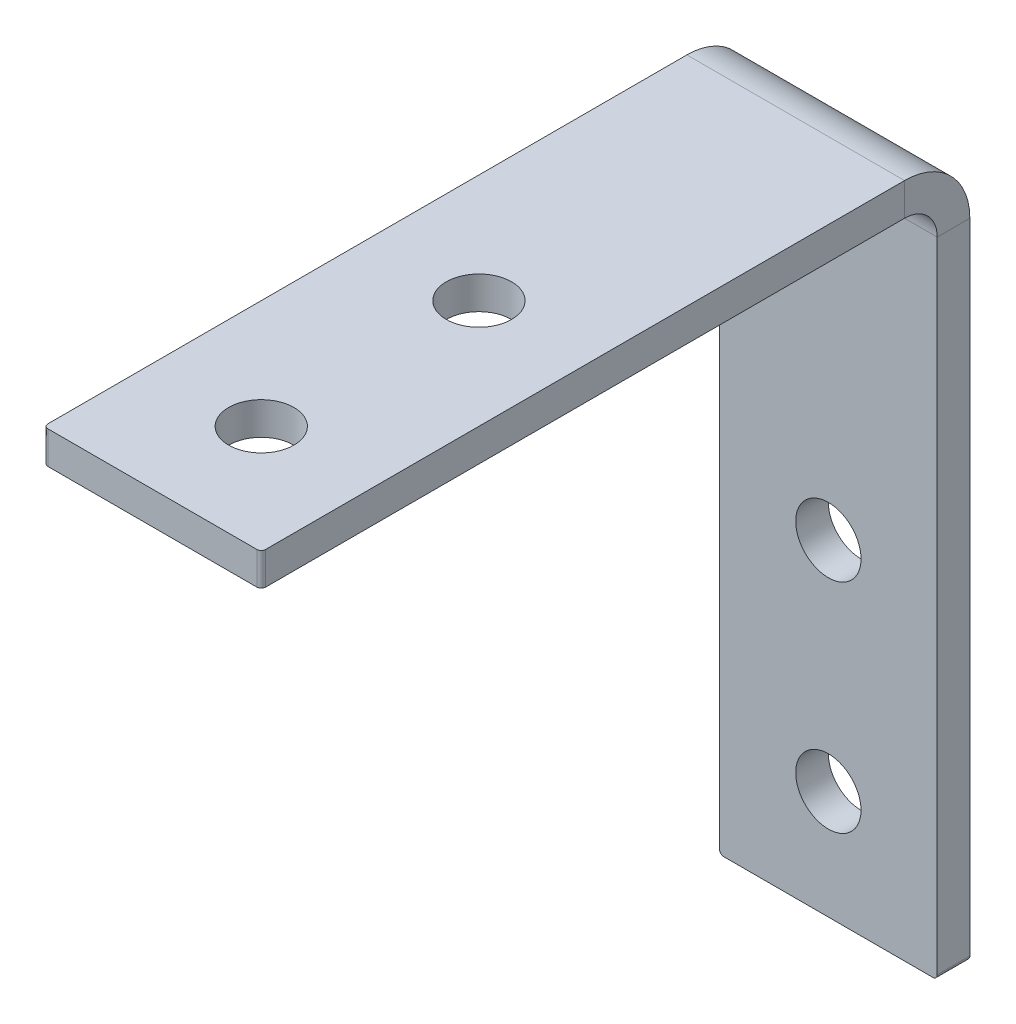
ISO-10303-21;
HEADER;
FILE_DESCRIPTION(('STEP AP214'),'2;1');
FILE_NAME('part.step','',(''),(''),'','','');
FILE_SCHEMA(('AUTOMOTIVE_DESIGN { 1 0 10303 214 1 1 1 1 }'));
ENDSEC;
DATA;
#1=APPLICATION_CONTEXT('core data for automotive mechanical design processes');
#2=APPLICATION_PROTOCOL_DEFINITION('international standard','automotive_design',2000,#1);
#3=PRODUCT_CONTEXT('',#1,'mechanical');
#4=PRODUCT('Part','Part','',(#3));
#5=PRODUCT_RELATED_PRODUCT_CATEGORY('part','',(#4));
#6=PRODUCT_DEFINITION_FORMATION('','',#4);
#7=PRODUCT_DEFINITION_CONTEXT('part definition',#1,'design');
#8=PRODUCT_DEFINITION('design','',#6,#7);
#9=PRODUCT_DEFINITION_SHAPE('','',#8);
#10=(LENGTH_UNIT() NAMED_UNIT(*) SI_UNIT(.MILLI.,.METRE.));
#11=(NAMED_UNIT(*) PLANE_ANGLE_UNIT() SI_UNIT($,.RADIAN.));
#12=(NAMED_UNIT(*) SI_UNIT($,.STERADIAN.) SOLID_ANGLE_UNIT());
#13=UNCERTAINTY_MEASURE_WITH_UNIT(LENGTH_MEASURE(1.E-05),#10,'distance_accuracy_value','');
#14=(GEOMETRIC_REPRESENTATION_CONTEXT(3) GLOBAL_UNCERTAINTY_ASSIGNED_CONTEXT((#13)) GLOBAL_UNIT_ASSIGNED_CONTEXT((#10,
#11,#12)) REPRESENTATION_CONTEXT('',''));
#15=CARTESIAN_POINT('',(0.,0.,0.));
#16=DIRECTION('',(0.,0.,1.));
#17=DIRECTION('',(1.,0.,0.));
#18=AXIS2_PLACEMENT_3D('',#15,#16,#17);
#19=CARTESIAN_POINT('',(10.,-1.69646003293849,-3.375));
#20=DIRECTION('',(1.,0.,0.));
#21=DIRECTION('',(0.,1.,0.));
#22=AXIS2_PLACEMENT_3D('',#19,#20,#21);
#23=PLANE('',#22);
#24=CARTESIAN_POINT('',(10.,-1.69646003293849,2.25));
#25=DIRECTION('',(-1.,0.,0.));
#26=DIRECTION('',(0.,0.,-1.));
#27=AXIS2_PLACEMENT_3D('',#24,#25,#26);
#28=CIRCLE('',#27,3.);
#29=CARTESIAN_POINT('',(10.,1.30353996706151,2.25));
#30=VERTEX_POINT('',#29);
#31=CARTESIAN_POINT('',(10.,-1.69646003293849,-0.75));
#32=VERTEX_POINT('',#31);
#33=EDGE_CURVE('E26',#30,#32,#28,.T.);
#34=ORIENTED_EDGE('',*,*,#33,.F.);
#35=DIRECTION('',(0.,1.,0.));
#36=VECTOR('',#35,1.);
#37=CARTESIAN_POINT('',(10.,-0.196460032938488,2.25));
#38=LINE('',#37,#36);
#39=CARTESIAN_POINT('',(10.,-0.196460032938488,2.25));
#40=VERTEX_POINT('',#39);
#41=EDGE_CURVE('E40',#40,#30,#38,.T.);
#42=ORIENTED_EDGE('',*,*,#41,.F.);
#43=CARTESIAN_POINT('',(10.,-1.69646003293849,2.25));
#44=DIRECTION('',(1.,0.,0.));
#45=DIRECTION('',(0.,0.,-1.));
#46=AXIS2_PLACEMENT_3D('',#43,#44,#45);
#47=CIRCLE('',#46,1.5);
#48=CARTESIAN_POINT('',(10.,-1.69646003293849,0.75));
#49=VERTEX_POINT('',#48);
#50=EDGE_CURVE('E246',#49,#40,#47,.T.);
#51=ORIENTED_EDGE('',*,*,#50,.F.);
#52=DIRECTION('',(0.,0.,1.));
#53=VECTOR('',#52,1.);
#54=CARTESIAN_POINT('',(10.,-1.69646003293849,-0.75));
#55=LINE('',#54,#53);
#56=EDGE_CURVE('E313',#32,#49,#55,.T.);
#57=ORIENTED_EDGE('',*,*,#56,.F.);
#58=EDGE_LOOP('',(#34,#42,#51,#57));
#59=FACE_BOUND('',#58,.T.);
#60=ADVANCED_FACE('F15',(#59),#23,.T.);
#61=CARTESIAN_POINT('',(0.,-1.69646003293849,-3.375));
#62=DIRECTION('',(1.,0.,0.));
#63=DIRECTION('',(0.,1.,0.));
#64=AXIS2_PLACEMENT_3D('',#61,#62,#63);
#65=PLANE('',#64);
#66=CARTESIAN_POINT('',(0.,-1.69646003293849,2.25));
#67=DIRECTION('',(1.,0.,0.));
#68=DIRECTION('',(0.,0.,-1.));
#69=AXIS2_PLACEMENT_3D('',#66,#67,#68);
#70=CIRCLE('',#69,3.);
#71=CARTESIAN_POINT('',(0.,-1.69646003293849,-0.75));
#72=VERTEX_POINT('',#71);
#73=CARTESIAN_POINT('',(0.,1.30353996706151,2.25));
#74=VERTEX_POINT('',#73);
#75=EDGE_CURVE('E10',#72,#74,#70,.T.);
#76=ORIENTED_EDGE('',*,*,#75,.F.);
#77=DIRECTION('',(0.,0.,-1.));
#78=VECTOR('',#77,1.);
#79=CARTESIAN_POINT('',(0.,-1.69646003293849,0.75));
#80=LINE('',#79,#78);
#81=CARTESIAN_POINT('',(0.,-1.69646003293849,0.75));
#82=VERTEX_POINT('',#81);
#83=EDGE_CURVE('E247',#82,#72,#80,.T.);
#84=ORIENTED_EDGE('',*,*,#83,.F.);
#85=CARTESIAN_POINT('',(0.,-1.69646003293849,2.25));
#86=DIRECTION('',(-1.,0.,0.));
#87=DIRECTION('',(0.,0.,-1.));
#88=AXIS2_PLACEMENT_3D('',#85,#86,#87);
#89=CIRCLE('',#88,1.5);
#90=CARTESIAN_POINT('',(0.,-0.196460032938488,2.25));
#91=VERTEX_POINT('',#90);
#92=EDGE_CURVE('E242',#91,#82,#89,.T.);
#93=ORIENTED_EDGE('',*,*,#92,.F.);
#94=DIRECTION('',(0.,-1.,0.));
#95=VECTOR('',#94,1.);
#96=CARTESIAN_POINT('',(0.,1.30353996706151,2.25));
#97=LINE('',#96,#95);
#98=EDGE_CURVE('E208',#74,#91,#97,.T.);
#99=ORIENTED_EDGE('',*,*,#98,.F.);
#100=EDGE_LOOP('',(#76,#84,#93,#99));
#101=FACE_BOUND('',#100,.T.);
#102=ADVANCED_FACE('F370',(#101),#65,.F.);
#103=CARTESIAN_POINT('',(5.,-1.69646003293849,2.25));
#104=DIRECTION('',(1.,0.,0.));
#105=DIRECTION('',(0.,0.,-1.));
#106=AXIS2_PLACEMENT_3D('',#103,#104,#105);
#107=CYLINDRICAL_SURFACE('',#106,3.);
#108=ORIENTED_EDGE('',*,*,#75,.T.);
#109=DIRECTION('',(-1.,0.,0.));
#110=VECTOR('',#109,1.);
#111=CARTESIAN_POINT('',(10.,1.30353996706151,2.25));
#112=LINE('',#111,#110);
#113=EDGE_CURVE('E260',#30,#74,#112,.T.);
#114=ORIENTED_EDGE('',*,*,#113,.F.);
#115=ORIENTED_EDGE('',*,*,#33,.T.);
#116=DIRECTION('',(1.,0.,0.));
#117=VECTOR('',#116,1.);
#118=CARTESIAN_POINT('',(0.,-1.69646003293849,-0.75));
#119=LINE('',#118,#117);
#120=EDGE_CURVE('E279',#72,#32,#119,.T.);
#121=ORIENTED_EDGE('',*,*,#120,.F.);
#122=EDGE_LOOP('',(#108,#114,#115,#121));
#123=FACE_BOUND('',#122,.T.);
#124=ADVANCED_FACE('F372',(#123),#107,.T.);
#125=CARTESIAN_POINT('',(5.,-1.69646003293849,2.25));
#126=DIRECTION('',(1.,0.,0.));
#127=DIRECTION('',(0.,0.,-1.));
#128=AXIS2_PLACEMENT_3D('',#125,#126,#127);
#129=CYLINDRICAL_SURFACE('',#128,1.5);
#130=ORIENTED_EDGE('',*,*,#92,.T.);
#131=DIRECTION('',(-1.,0.,0.));
#132=VECTOR('',#131,1.);
#133=CARTESIAN_POINT('',(10.,-1.69646003293849,0.75));
#134=LINE('',#133,#132);
#135=EDGE_CURVE('E308',#49,#82,#134,.T.);
#136=ORIENTED_EDGE('',*,*,#135,.F.);
#137=ORIENTED_EDGE('',*,*,#50,.T.);
#138=DIRECTION('',(1.,0.,0.));
#139=VECTOR('',#138,1.);
#140=CARTESIAN_POINT('',(0.,-0.196460032938488,2.25));
#141=LINE('',#140,#139);
#142=EDGE_CURVE('E237',#91,#40,#141,.T.);
#143=ORIENTED_EDGE('',*,*,#142,.F.);
#144=EDGE_LOOP('',(#130,#136,#137,#143));
#145=FACE_BOUND('',#144,.T.);
#146=ADVANCED_FACE('F536',(#145),#129,.F.);
#147=CARTESIAN_POINT('',(5.,15.3554568738932,0.75));
#148=DIRECTION('',(0.,0.,1.));
#149=DIRECTION('',(1.,0.,0.));
#150=AXIS2_PLACEMENT_3D('',#147,#148,#149);
#151=PLANE('',#150);
#152=ORIENTED_EDGE('',*,*,#135,.T.);
#153=DIRECTION('',(0.,1.,0.));
#154=VECTOR('',#153,1.);
#155=CARTESIAN_POINT('',(0.,-31.05,0.75));
#156=LINE('',#155,#154);
#157=CARTESIAN_POINT('',(0.,-31.05,0.75));
#158=VERTEX_POINT('',#157);
#159=EDGE_CURVE('E252',#158,#82,#156,.T.);
#160=ORIENTED_EDGE('',*,*,#159,.F.);
#161=CARTESIAN_POINT('',(0.20000000000001,-31.05,0.75));
#162=DIRECTION('',(0.,0.,-1.));
#163=DIRECTION('',(-0.707106781186539,-0.707106781186556,0.));
#164=AXIS2_PLACEMENT_3D('',#161,#162,#163);
#165=CIRCLE('',#164,0.2);
#166=CARTESIAN_POINT('',(0.200000000000009,-31.25,0.75));
#167=VERTEX_POINT('',#166);
#168=EDGE_CURVE('E203',#167,#158,#165,.T.);
#169=ORIENTED_EDGE('',*,*,#168,.F.);
#170=DIRECTION('',(1.,0.,0.));
#171=VECTOR('',#170,1.);
#172=CARTESIAN_POINT('',(0.200000000000008,-31.25,0.75));
#173=LINE('',#172,#171);
#174=CARTESIAN_POINT('',(9.8,-31.25,0.75));
#175=VERTEX_POINT('',#174);
#176=EDGE_CURVE('E19',#167,#175,#173,.T.);
#177=ORIENTED_EDGE('',*,*,#176,.T.);
#178=CARTESIAN_POINT('',(9.8,-31.05,0.75));
#179=DIRECTION('',(0.,0.,-1.));
#180=DIRECTION('',(0.707106781186551,-0.707106781186544,0.));
#181=AXIS2_PLACEMENT_3D('',#178,#179,#180);
#182=CIRCLE('',#181,0.2);
#183=CARTESIAN_POINT('',(10.,-31.05,0.75));
#184=VERTEX_POINT('',#183);
#185=EDGE_CURVE('E301',#184,#175,#182,.T.);
#186=ORIENTED_EDGE('',*,*,#185,.F.);
#187=DIRECTION('',(0.,1.,0.));
#188=VECTOR('',#187,1.);
#189=CARTESIAN_POINT('',(10.,-31.05,0.75));
#190=LINE('',#189,#188);
#191=EDGE_CURVE('E251',#184,#49,#190,.T.);
#192=ORIENTED_EDGE('',*,*,#191,.T.);
#193=EDGE_LOOP('',(#152,#160,#169,#177,#186,#192));
#194=FACE_BOUND('',#193,.T.);
#195=CARTESIAN_POINT('',(5.,-26.25,0.75));
#196=DIRECTION('',(0.,0.,1.));
#197=DIRECTION('',(-1.,0.,0.));
#198=AXIS2_PLACEMENT_3D('',#195,#196,#197);
#199=CIRCLE('',#198,1.5);
#200=CARTESIAN_POINT('',(6.5,-26.25,0.75));
#201=VERTEX_POINT('',#200);
#202=EDGE_CURVE('E219',#201,#201,#199,.T.);
#203=ORIENTED_EDGE('',*,*,#202,.F.);
#204=EDGE_LOOP('',(#203));
#205=FACE_BOUND('',#204,.T.);
#206=CARTESIAN_POINT('',(5.,-16.25,0.75));
#207=DIRECTION('',(0.,0.,1.));
#208=DIRECTION('',(-1.,0.,0.));
#209=AXIS2_PLACEMENT_3D('',#206,#207,#208);
#210=CIRCLE('',#209,1.5);
#211=CARTESIAN_POINT('',(6.5,-16.25,0.75));
#212=VERTEX_POINT('',#211);
#213=EDGE_CURVE('E276',#212,#212,#210,.T.);
#214=ORIENTED_EDGE('',*,*,#213,.F.);
#215=EDGE_LOOP('',(#214));
#216=FACE_BOUND('',#215,.T.);
#217=ADVANCED_FACE('F587',(#194,#205,#216),#151,.T.);
#218=CARTESIAN_POINT('',(0.,0.,0.));
#219=DIRECTION('',(-1.,0.,0.));
#220=DIRECTION('',(0.,0.,1.));
#221=AXIS2_PLACEMENT_3D('',#218,#219,#220);
#222=PLANE('',#221);
#223=ORIENTED_EDGE('',*,*,#83,.T.);
#224=DIRECTION('',(0.,1.,0.));
#225=VECTOR('',#224,1.);
#226=CARTESIAN_POINT('',(0.,-31.05,-0.75));
#227=LINE('',#226,#225);
#228=CARTESIAN_POINT('',(0.,-31.05,-0.75));
#229=VERTEX_POINT('',#228);
#230=EDGE_CURVE('E297',#229,#72,#227,.T.);
#231=ORIENTED_EDGE('',*,*,#230,.F.);
#232=DIRECTION('',(0.,0.,-1.));
#233=VECTOR('',#232,1.);
#234=CARTESIAN_POINT('',(0.,-31.05,0.75));
#235=LINE('',#234,#233);
#236=EDGE_CURVE('E207',#158,#229,#235,.T.);
#237=ORIENTED_EDGE('',*,*,#236,.F.);
#238=ORIENTED_EDGE('',*,*,#159,.T.);
#239=EDGE_LOOP('',(#223,#231,#237,#238));
#240=FACE_BOUND('',#239,.T.);
#241=ADVANCED_FACE('F582',(#240),#222,.T.);
#242=CARTESIAN_POINT('',(9.8,-31.05,0.));
#243=DIRECTION('',(0.,0.,1.));
#244=DIRECTION('',(0.707106781186551,-0.707106781186544,0.));
#245=AXIS2_PLACEMENT_3D('',#242,#243,#244);
#246=CYLINDRICAL_SURFACE('',#245,0.2);
#247=ORIENTED_EDGE('',*,*,#185,.T.);
#248=DIRECTION('',(0.,0.,-1.));
#249=VECTOR('',#248,1.);
#250=CARTESIAN_POINT('',(9.8,-31.25,0.75));
#251=LINE('',#250,#249);
#252=CARTESIAN_POINT('',(9.8,-31.25,-0.75));
#253=VERTEX_POINT('',#252);
#254=EDGE_CURVE('E340',#175,#253,#251,.T.);
#255=ORIENTED_EDGE('',*,*,#254,.T.);
#256=CARTESIAN_POINT('',(9.8,-31.05,-0.75));
#257=DIRECTION('',(0.,0.,1.));
#258=DIRECTION('',(0.707106781186551,-0.707106781186544,0.));
#259=AXIS2_PLACEMENT_3D('',#256,#257,#258);
#260=CIRCLE('',#259,0.2);
#261=CARTESIAN_POINT('',(10.,-31.05,-0.75));
#262=VERTEX_POINT('',#261);
#263=EDGE_CURVE('E334',#253,#262,#260,.T.);
#264=ORIENTED_EDGE('',*,*,#263,.T.);
#265=DIRECTION('',(0.,0.,1.));
#266=VECTOR('',#265,1.);
#267=CARTESIAN_POINT('',(10.,-31.05,-0.75));
#268=LINE('',#267,#266);
#269=EDGE_CURVE('E206',#262,#184,#268,.T.);
#270=ORIENTED_EDGE('',*,*,#269,.T.);
#271=EDGE_LOOP('',(#247,#255,#264,#270));
#272=FACE_BOUND('',#271,.T.);
#273=ADVANCED_FACE('F586',(#272),#246,.T.);
#274=CARTESIAN_POINT('',(9.8,-31.25,-0.75));
#275=CARTESIAN_POINT('',(0.200000000000008,-31.25,-0.75));
#276=CARTESIAN_POINT('',(9.8,-31.25,0.75));
#277=CARTESIAN_POINT('',(0.200000000000008,-31.25,0.75));
#278=(BOUNDED_SURFACE() B_SPLINE_SURFACE(1,1,((#274,#275),(#276,#277)),.UNSPECIFIED.,.F.,.F.,
.F.) B_SPLINE_SURFACE_WITH_KNOTS((2,2),(2,2),(0.,1.5),(0.,9.6),
.UNSPECIFIED.) GEOMETRIC_REPRESENTATION_ITEM() RATIONAL_B_SPLINE_SURFACE(((1.,1.),(1.,1.))) REPRESENTATION_ITEM('') SURFACE());
#279=DIRECTION('',(0.,0.,1.));
#280=VECTOR('',#279,1.);
#281=CARTESIAN_POINT('',(0.20000000000001,-31.25,-0.75));
#282=LINE('',#281,#280);
#283=CARTESIAN_POINT('',(0.200000000000009,-31.25,-0.75));
#284=VERTEX_POINT('',#283);
#285=EDGE_CURVE('E228',#284,#167,#282,.T.);
#286=DIRECTION('',(-1.,0.,0.));
#287=VECTOR('',#286,1.);
#288=CARTESIAN_POINT('',(9.8,-31.25,-0.75));
#289=LINE('',#288,#287);
#290=EDGE_CURVE('E288',#253,#284,#289,.T.);
#291=ORIENTED_EDGE('',*,*,#254,.F.);
#292=ORIENTED_EDGE('',*,*,#176,.F.);
#293=ORIENTED_EDGE('',*,*,#285,.F.);
#294=ORIENTED_EDGE('',*,*,#290,.F.);
#295=EDGE_LOOP('',(#291,#292,#293,#294));
#296=FACE_BOUND('',#295,.T.);
#297=ADVANCED_FACE('F602',(#296),#278,.T.);
#298=CARTESIAN_POINT('',(0.20000000000001,-31.05,0.));
#299=DIRECTION('',(0.,0.,1.));
#300=DIRECTION('',(-0.707106781186539,-0.707106781186556,0.));
#301=AXIS2_PLACEMENT_3D('',#298,#299,#300);
#302=CYLINDRICAL_SURFACE('',#301,0.2);
#303=ORIENTED_EDGE('',*,*,#168,.T.);
#304=ORIENTED_EDGE('',*,*,#236,.T.);
#305=CARTESIAN_POINT('',(0.20000000000001,-31.05,-0.75));
#306=DIRECTION('',(0.,0.,1.));
#307=DIRECTION('',(-0.707106781186539,-0.707106781186556,0.));
#308=AXIS2_PLACEMENT_3D('',#305,#306,#307);
#309=CIRCLE('',#308,0.2);
#310=EDGE_CURVE('E269',#229,#284,#309,.T.);
#311=ORIENTED_EDGE('',*,*,#310,.T.);
#312=ORIENTED_EDGE('',*,*,#285,.T.);
#313=EDGE_LOOP('',(#303,#304,#311,#312));
#314=FACE_BOUND('',#313,.T.);
#315=ADVANCED_FACE('F576',(#314),#302,.T.);
#316=CARTESIAN_POINT('',(6.5,-26.25,-0.75));
#317=CARTESIAN_POINT('',(6.5,-27.75,-0.75));
#318=CARTESIAN_POINT('',(5.,-27.75,-0.75));
#319=CARTESIAN_POINT('',(3.49999999999999,-27.75,-0.75));
#320=CARTESIAN_POINT('',(3.5,-26.25,-0.75));
#321=CARTESIAN_POINT('',(3.49999999999999,-24.75,-0.75));
#322=CARTESIAN_POINT('',(5.,-24.75,-0.75));
#323=CARTESIAN_POINT('',(6.5,-24.75,-0.75));
#324=CARTESIAN_POINT('',(6.5,-26.25,-0.75));
#325=CARTESIAN_POINT('',(6.5,-26.25,0.75));
#326=CARTESIAN_POINT('',(6.5,-27.75,0.75));
#327=CARTESIAN_POINT('',(5.,-27.75,0.75));
#328=CARTESIAN_POINT('',(3.49999999999999,-27.75,0.75));
#329=CARTESIAN_POINT('',(3.5,-26.25,0.75));
#330=CARTESIAN_POINT('',(3.49999999999999,-24.75,0.75));
#331=CARTESIAN_POINT('',(5.,-24.75,0.75));
#332=CARTESIAN_POINT('',(6.5,-24.75,0.75));
#333=CARTESIAN_POINT('',(6.5,-26.25,0.75));
#334=(BOUNDED_SURFACE() B_SPLINE_SURFACE(1,2,((#316,#317,#318,#319,#320,#321,#322,#323,#324),
(#325,#326,#327,#328,#329,#330,#331,#332,#333)),.UNSPECIFIED.,.F.,.T.,
.F.) B_SPLINE_SURFACE_WITH_KNOTS((2,2),(3,2,2,2,3),(-0.5,0.5),(0.,2.35619449019234,
4.71238898038469,7.06858347057704,9.42477796076938),
.UNSPECIFIED.) GEOMETRIC_REPRESENTATION_ITEM() RATIONAL_B_SPLINE_SURFACE(((1.,0.707106781186548,
1.,0.707106781186548,1.,0.707106781186548,1.,0.707106781186548,1.),(1.,0.707106781186548,1.,
0.707106781186548,1.,0.707106781186548,1.,0.707106781186548,1.))) REPRESENTATION_ITEM('') SURFACE());
#335=CARTESIAN_POINT('',(5.,-26.25,-0.75));
#336=DIRECTION('',(0.,0.,-1.));
#337=DIRECTION('',(-1.,0.,0.));
#338=AXIS2_PLACEMENT_3D('',#335,#336,#337);
#339=CIRCLE('',#338,1.5);
#340=CARTESIAN_POINT('',(6.5,-26.25,-0.75));
#341=VERTEX_POINT('',#340);
#342=EDGE_CURVE('E223',#341,#341,#339,.T.);
#343=ORIENTED_EDGE('',*,*,#342,.T.);
#344=EDGE_LOOP('',(#343));
#345=FACE_BOUND('',#344,.T.);
#346=ORIENTED_EDGE('',*,*,#202,.T.);
#347=EDGE_LOOP('',(#346));
#348=FACE_BOUND('',#347,.T.);
#349=ADVANCED_FACE('F560',(#345,#348),#334,.F.);
#350=CARTESIAN_POINT('',(6.5,-16.25,-0.75));
#351=CARTESIAN_POINT('',(6.5,-17.75,-0.75));
#352=CARTESIAN_POINT('',(5.,-17.75,-0.75));
#353=CARTESIAN_POINT('',(3.49999999999999,-17.75,-0.75));
#354=CARTESIAN_POINT('',(3.5,-16.25,-0.75));
#355=CARTESIAN_POINT('',(3.49999999999999,-14.75,-0.75));
#356=CARTESIAN_POINT('',(5.,-14.75,-0.75));
#357=CARTESIAN_POINT('',(6.5,-14.75,-0.75));
#358=CARTESIAN_POINT('',(6.5,-16.25,-0.75));
#359=CARTESIAN_POINT('',(6.5,-16.25,0.75));
#360=CARTESIAN_POINT('',(6.5,-17.75,0.75));
#361=CARTESIAN_POINT('',(5.,-17.75,0.75));
#362=CARTESIAN_POINT('',(3.49999999999999,-17.75,0.75));
#363=CARTESIAN_POINT('',(3.5,-16.25,0.75));
#364=CARTESIAN_POINT('',(3.49999999999999,-14.75,0.75));
#365=CARTESIAN_POINT('',(5.,-14.75,0.75));
#366=CARTESIAN_POINT('',(6.5,-14.75,0.75));
#367=CARTESIAN_POINT('',(6.5,-16.25,0.75));
#368=(BOUNDED_SURFACE() B_SPLINE_SURFACE(1,2,((#350,#351,#352,#353,#354,#355,#356,#357,#358),
(#359,#360,#361,#362,#363,#364,#365,#366,#367)),.UNSPECIFIED.,.F.,.T.,
.F.) B_SPLINE_SURFACE_WITH_KNOTS((2,2),(3,2,2,2,3),(-0.5,0.5),(0.,2.35619449019234,
4.71238898038469,7.06858347057704,9.42477796076938),
.UNSPECIFIED.) GEOMETRIC_REPRESENTATION_ITEM() RATIONAL_B_SPLINE_SURFACE(((1.,0.707106781186548,
1.,0.707106781186548,1.,0.707106781186548,1.,0.707106781186548,1.),(1.,0.707106781186548,1.,
0.707106781186548,1.,0.707106781186548,1.,0.707106781186548,1.))) REPRESENTATION_ITEM('') SURFACE());
#369=CARTESIAN_POINT('',(5.,-16.25,-0.75));
#370=DIRECTION('',(0.,0.,-1.));
#371=DIRECTION('',(-1.,0.,0.));
#372=AXIS2_PLACEMENT_3D('',#369,#370,#371);
#373=CIRCLE('',#372,1.5);
#374=CARTESIAN_POINT('',(6.5,-16.25,-0.75));
#375=VERTEX_POINT('',#374);
#376=EDGE_CURVE('E224',#375,#375,#373,.T.);
#377=ORIENTED_EDGE('',*,*,#376,.T.);
#378=EDGE_LOOP('',(#377));
#379=FACE_BOUND('',#378,.T.);
#380=ORIENTED_EDGE('',*,*,#213,.T.);
#381=EDGE_LOOP('',(#380));
#382=FACE_BOUND('',#381,.T.);
#383=ADVANCED_FACE('F552',(#379,#382),#368,.F.);
#384=CARTESIAN_POINT('',(5.,15.3554568738932,-0.75));
#385=DIRECTION('',(0.,0.,1.));
#386=DIRECTION('',(1.,0.,0.));
#387=AXIS2_PLACEMENT_3D('',#384,#385,#386);
#388=PLANE('',#387);
#389=ORIENTED_EDGE('',*,*,#120,.T.);
#390=DIRECTION('',(0.,1.,0.));
#391=VECTOR('',#390,1.);
#392=CARTESIAN_POINT('',(10.,-31.05,-0.75));
#393=LINE('',#392,#391);
#394=EDGE_CURVE('E212',#262,#32,#393,.T.);
#395=ORIENTED_EDGE('',*,*,#394,.F.);
#396=ORIENTED_EDGE('',*,*,#263,.F.);
#397=ORIENTED_EDGE('',*,*,#290,.T.);
#398=ORIENTED_EDGE('',*,*,#310,.F.);
#399=ORIENTED_EDGE('',*,*,#230,.T.);
#400=EDGE_LOOP('',(#389,#395,#396,#397,#398,#399));
#401=FACE_BOUND('',#400,.T.);
#402=ORIENTED_EDGE('',*,*,#376,.F.);
#403=EDGE_LOOP('',(#402));
#404=FACE_BOUND('',#403,.T.);
#405=ORIENTED_EDGE('',*,*,#342,.F.);
#406=EDGE_LOOP('',(#405));
#407=FACE_BOUND('',#406,.T.);
#408=ADVANCED_FACE('F548',(#401,#404,#407),#388,.F.);
#409=CARTESIAN_POINT('',(10.,31.25,0.));
#410=DIRECTION('',(1.,0.,0.));
#411=DIRECTION('',(0.,1.,0.));
#412=AXIS2_PLACEMENT_3D('',#409,#410,#411);
#413=PLANE('',#412);
#414=ORIENTED_EDGE('',*,*,#56,.T.);
#415=ORIENTED_EDGE('',*,*,#191,.F.);
#416=ORIENTED_EDGE('',*,*,#269,.F.);
#417=ORIENTED_EDGE('',*,*,#394,.T.);
#418=EDGE_LOOP('',(#414,#415,#416,#417));
#419=FACE_BOUND('',#418,.T.);
#420=ADVANCED_FACE('F512',(#419),#413,.T.);
#421=CARTESIAN_POINT('',(5.,0.553539967061515,16.8035399670615));
#422=DIRECTION('',(0.,-1.,0.));
#423=DIRECTION('',(-1.,0.,0.));
#424=AXIS2_PLACEMENT_3D('',#421,#422,#423);
#425=CYLINDRICAL_SURFACE('',#424,1.5);
#426=CARTESIAN_POINT('',(5.,1.30353996706151,16.8035399670615));
#427=DIRECTION('',(0.,-1.,0.));
#428=DIRECTION('',(-1.,0.,0.));
#429=AXIS2_PLACEMENT_3D('',#426,#427,#428);
#430=CIRCLE('',#429,1.5);
#431=CARTESIAN_POINT('',(6.5,1.30353996706151,16.8035399670615));
#432=VERTEX_POINT('',#431);
#433=EDGE_CURVE('E218',#432,#432,#430,.T.);
#434=ORIENTED_EDGE('',*,*,#433,.F.);
#435=EDGE_LOOP('',(#434));
#436=FACE_BOUND('',#435,.T.);
#437=CARTESIAN_POINT('',(5.,-0.196460032938485,16.8035399670615));
#438=DIRECTION('',(0.,1.,0.));
#439=DIRECTION('',(-1.,0.,0.));
#440=AXIS2_PLACEMENT_3D('',#437,#438,#439);
#441=CIRCLE('',#440,1.5);
#442=CARTESIAN_POINT('',(6.5,-0.196460032938485,16.8035399670615));
#443=VERTEX_POINT('',#442);
#444=EDGE_CURVE('E273',#443,#443,#441,.T.);
#445=ORIENTED_EDGE('',*,*,#444,.F.);
#446=EDGE_LOOP('',(#445));
#447=FACE_BOUND('',#446,.T.);
#448=ADVANCED_FACE('F17',(#436,#447),#425,.F.);
#449=CARTESIAN_POINT('',(5.,0.553539967061517,26.8035399670615));
#450=DIRECTION('',(0.,-1.,0.));
#451=DIRECTION('',(-1.,0.,0.));
#452=AXIS2_PLACEMENT_3D('',#449,#450,#451);
#453=CYLINDRICAL_SURFACE('',#452,1.5);
#454=CARTESIAN_POINT('',(5.,1.30353996706152,26.8035399670615));
#455=DIRECTION('',(0.,-1.,0.));
#456=DIRECTION('',(-1.,0.,0.));
#457=AXIS2_PLACEMENT_3D('',#454,#455,#456);
#458=CIRCLE('',#457,1.5);
#459=CARTESIAN_POINT('',(6.5,1.30353996706152,26.8035399670615));
#460=VERTEX_POINT('',#459);
#461=EDGE_CURVE('E213',#460,#460,#458,.T.);
#462=ORIENTED_EDGE('',*,*,#461,.F.);
#463=EDGE_LOOP('',(#462));
#464=FACE_BOUND('',#463,.T.);
#465=CARTESIAN_POINT('',(5.,-0.196460032938483,26.8035399670615));
#466=DIRECTION('',(0.,1.,0.));
#467=DIRECTION('',(-1.,0.,0.));
#468=AXIS2_PLACEMENT_3D('',#465,#466,#467);
#469=CIRCLE('',#468,1.5);
#470=CARTESIAN_POINT('',(6.5,-0.196460032938483,26.8035399670615));
#471=VERTEX_POINT('',#470);
#472=EDGE_CURVE('E238',#471,#471,#469,.T.);
#473=ORIENTED_EDGE('',*,*,#472,.F.);
#474=EDGE_LOOP('',(#473));
#475=FACE_BOUND('',#474,.T.);
#476=ADVANCED_FACE('F511',(#464,#475),#453,.F.);
#477=CARTESIAN_POINT('',(0.,0.553539967061511,0.553539967061511));
#478=DIRECTION('',(-1.,0.,0.));
#479=DIRECTION('',(0.,0.,1.));
#480=AXIS2_PLACEMENT_3D('',#477,#478,#479);
#481=PLANE('',#480);
#482=ORIENTED_EDGE('',*,*,#98,.T.);
#483=DIRECTION('',(0.,0.,1.));
#484=VECTOR('',#483,1.);
#485=CARTESIAN_POINT('',(0.,-0.196460032938488,2.25));
#486=LINE('',#485,#484);
#487=CARTESIAN_POINT('',(0.,-0.196460032938482,31.6035399670615));
#488=VERTEX_POINT('',#487);
#489=EDGE_CURVE('E183',#91,#488,#486,.T.);
#490=ORIENTED_EDGE('',*,*,#489,.T.);
#491=DIRECTION('',(0.,-1.,0.));
#492=VECTOR('',#491,1.);
#493=CARTESIAN_POINT('',(0.,1.30353996706152,31.6035399670615));
#494=LINE('',#493,#492);
#495=CARTESIAN_POINT('',(0.,1.30353996706152,31.6035399670615));
#496=VERTEX_POINT('',#495);
#497=EDGE_CURVE('E178',#496,#488,#494,.T.);
#498=ORIENTED_EDGE('',*,*,#497,.F.);
#499=DIRECTION('',(0.,0.,1.));
#500=VECTOR('',#499,1.);
#501=CARTESIAN_POINT('',(0.,1.30353996706151,2.25));
#502=LINE('',#501,#500);
#503=EDGE_CURVE('E217',#74,#496,#502,.T.);
#504=ORIENTED_EDGE('',*,*,#503,.F.);
#505=EDGE_LOOP('',(#482,#490,#498,#504));
#506=FACE_BOUND('',#505,.T.);
#507=ADVANCED_FACE('F373',(#506),#481,.T.);
#508=CARTESIAN_POINT('',(0.199999999999991,0.553539967061518,31.6035399670615));
#509=DIRECTION('',(0.,-1.,0.));
#510=DIRECTION('',(-0.707106781186539,0.,0.707106781186556));
#511=AXIS2_PLACEMENT_3D('',#508,#509,#510);
#512=CYLINDRICAL_SURFACE('',#511,0.2);
#513=CARTESIAN_POINT('',(0.199999999999991,-0.196460032938482,31.6035399670615));
#514=DIRECTION('',(0.,1.,0.));
#515=DIRECTION('',(-0.707106781186539,0.,0.707106781186556));
#516=AXIS2_PLACEMENT_3D('',#513,#514,#515);
#517=CIRCLE('',#516,0.2);
#518=CARTESIAN_POINT('',(0.19999999999999,-0.196460032938482,31.8035399670615));
#519=VERTEX_POINT('',#518);
#520=EDGE_CURVE('E172',#488,#519,#517,.T.);
#521=ORIENTED_EDGE('',*,*,#520,.T.);
#522=DIRECTION('',(0.,1.,0.));
#523=VECTOR('',#522,1.);
#524=CARTESIAN_POINT('',(0.199999999999991,-0.196460032938482,31.8035399670615));
#525=LINE('',#524,#523);
#526=CARTESIAN_POINT('',(0.19999999999999,1.30353996706152,31.8035399670615));
#527=VERTEX_POINT('',#526);
#528=EDGE_CURVE('E161',#519,#527,#525,.T.);
#529=ORIENTED_EDGE('',*,*,#528,.T.);
#530=CARTESIAN_POINT('',(0.199999999999991,1.30353996706152,31.6035399670615));
#531=DIRECTION('',(0.,-1.,0.));
#532=DIRECTION('',(-0.707106781186539,0.,0.707106781186556));
#533=AXIS2_PLACEMENT_3D('',#530,#531,#532);
#534=CIRCLE('',#533,0.2);
#535=EDGE_CURVE('E173',#527,#496,#534,.T.);
#536=ORIENTED_EDGE('',*,*,#535,.T.);
#537=ORIENTED_EDGE('',*,*,#497,.T.);
#538=EDGE_LOOP('',(#521,#529,#536,#537));
#539=FACE_BOUND('',#538,.T.);
#540=ADVANCED_FACE('F176',(#539),#512,.T.);
#541=CARTESIAN_POINT('',(0.,0.553539967061518,31.8035399670615));
#542=DIRECTION('',(0.,0.,1.));
#543=DIRECTION('',(1.,0.,0.));
#544=AXIS2_PLACEMENT_3D('',#541,#542,#543);
#545=PLANE('',#544);
#546=DIRECTION('',(0.,-1.,0.));
#547=VECTOR('',#546,1.);
#548=CARTESIAN_POINT('',(9.8,1.30353996706152,31.8035399670615));
#549=LINE('',#548,#547);
#550=CARTESIAN_POINT('',(9.8,1.30353996706152,31.8035399670615));
#551=VERTEX_POINT('',#550);
#552=CARTESIAN_POINT('',(9.8,-0.196460032938482,31.8035399670615));
#553=VERTEX_POINT('',#552);
#554=EDGE_CURVE('E233',#551,#553,#549,.T.);
#555=ORIENTED_EDGE('',*,*,#554,.F.);
#556=DIRECTION('',(-1.,0.,0.));
#557=VECTOR('',#556,1.);
#558=CARTESIAN_POINT('',(9.8,1.30353996706152,31.8035399670615));
#559=LINE('',#558,#557);
#560=EDGE_CURVE('E168',#551,#527,#559,.T.);
#561=ORIENTED_EDGE('',*,*,#560,.T.);
#562=ORIENTED_EDGE('',*,*,#528,.F.);
#563=DIRECTION('',(1.,0.,0.));
#564=VECTOR('',#563,1.);
#565=CARTESIAN_POINT('',(0.199999999999989,-0.196460032938482,31.8035399670615));
#566=LINE('',#565,#564);
#567=EDGE_CURVE('E165',#519,#553,#566,.T.);
#568=ORIENTED_EDGE('',*,*,#567,.T.);
#569=EDGE_LOOP('',(#555,#561,#562,#568));
#570=FACE_BOUND('',#569,.T.);
#571=ADVANCED_FACE('F163',(#570),#545,.T.);
#572=CARTESIAN_POINT('',(9.8,0.553539967061518,31.6035399670615));
#573=DIRECTION('',(0.,-1.,0.));
#574=DIRECTION('',(0.70710678118654,0.,0.707106781186555));
#575=AXIS2_PLACEMENT_3D('',#572,#573,#574);
#576=CYLINDRICAL_SURFACE('',#575,0.2);
#577=CARTESIAN_POINT('',(9.8,-0.196460032938482,31.6035399670615));
#578=DIRECTION('',(0.,1.,0.));
#579=DIRECTION('',(0.70710678118654,0.,0.707106781186555));
#580=AXIS2_PLACEMENT_3D('',#577,#578,#579);
#581=CIRCLE('',#580,0.2);
#582=CARTESIAN_POINT('',(10.,-0.196460032938482,31.6035399670615));
#583=VERTEX_POINT('',#582);
#584=EDGE_CURVE('E189',#553,#583,#581,.T.);
#585=ORIENTED_EDGE('',*,*,#584,.T.);
#586=DIRECTION('',(0.,1.,0.));
#587=VECTOR('',#586,1.);
#588=CARTESIAN_POINT('',(10.,-0.196460032938482,31.6035399670615));
#589=LINE('',#588,#587);
#590=CARTESIAN_POINT('',(10.,1.30353996706152,31.6035399670615));
#591=VERTEX_POINT('',#590);
#592=EDGE_CURVE('E198',#583,#591,#589,.T.);
#593=ORIENTED_EDGE('',*,*,#592,.T.);
#594=CARTESIAN_POINT('',(9.8,1.30353996706152,31.6035399670615));
#595=DIRECTION('',(0.,-1.,0.));
#596=DIRECTION('',(0.70710678118654,0.,0.707106781186555));
#597=AXIS2_PLACEMENT_3D('',#594,#595,#596);
#598=CIRCLE('',#597,0.2);
#599=EDGE_CURVE('E229',#591,#551,#598,.T.);
#600=ORIENTED_EDGE('',*,*,#599,.T.);
#601=ORIENTED_EDGE('',*,*,#554,.T.);
#602=EDGE_LOOP('',(#585,#593,#600,#601));
#603=FACE_BOUND('',#602,.T.);
#604=ADVANCED_FACE('F593',(#603),#576,.T.);
#605=CARTESIAN_POINT('',(5.,1.30353996706151,15.9089968409547));
#606=DIRECTION('',(0.,-1.,0.));
#607=DIRECTION('',(0.,0.,-1.));
#608=AXIS2_PLACEMENT_3D('',#605,#606,#607);
#609=PLANE('',#608);
#610=ORIENTED_EDGE('',*,*,#113,.T.);
#611=ORIENTED_EDGE('',*,*,#503,.T.);
#612=ORIENTED_EDGE('',*,*,#535,.F.);
#613=ORIENTED_EDGE('',*,*,#560,.F.);
#614=ORIENTED_EDGE('',*,*,#599,.F.);
#615=DIRECTION('',(0.,0.,1.));
#616=VECTOR('',#615,1.);
#617=CARTESIAN_POINT('',(10.,1.30353996706151,2.25));
#618=LINE('',#617,#616);
#619=EDGE_CURVE('E241',#30,#591,#618,.T.);
#620=ORIENTED_EDGE('',*,*,#619,.F.);
#621=EDGE_LOOP('',(#610,#611,#612,#613,#614,#620));
#622=FACE_BOUND('',#621,.T.);
#623=ORIENTED_EDGE('',*,*,#461,.T.);
#624=EDGE_LOOP('',(#623));
#625=FACE_BOUND('',#624,.T.);
#626=ORIENTED_EDGE('',*,*,#433,.T.);
#627=EDGE_LOOP('',(#626));
#628=FACE_BOUND('',#627,.T.);
#629=ADVANCED_FACE('F362',(#622,#625,#628),#609,.F.);
#630=CARTESIAN_POINT('',(10.,0.553539967061518,31.8035399670615));
#631=DIRECTION('',(1.,0.,0.));
#632=DIRECTION('',(0.,1.,0.));
#633=AXIS2_PLACEMENT_3D('',#630,#631,#632);
#634=PLANE('',#633);
#635=ORIENTED_EDGE('',*,*,#41,.T.);
#636=ORIENTED_EDGE('',*,*,#619,.T.);
#637=ORIENTED_EDGE('',*,*,#592,.F.);
#638=DIRECTION('',(0.,0.,1.));
#639=VECTOR('',#638,1.);
#640=CARTESIAN_POINT('',(10.,-0.196460032938488,2.25));
#641=LINE('',#640,#639);
#642=EDGE_CURVE('E234',#40,#583,#641,.T.);
#643=ORIENTED_EDGE('',*,*,#642,.F.);
#644=EDGE_LOOP('',(#635,#636,#637,#643));
#645=FACE_BOUND('',#644,.T.);
#646=ADVANCED_FACE('F518',(#645),#634,.T.);
#647=CARTESIAN_POINT('',(5.,-0.196460032938485,15.9089968409547));
#648=DIRECTION('',(0.,-1.,0.));
#649=DIRECTION('',(0.,0.,-1.));
#650=AXIS2_PLACEMENT_3D('',#647,#648,#649);
#651=PLANE('',#650);
#652=ORIENTED_EDGE('',*,*,#142,.T.);
#653=ORIENTED_EDGE('',*,*,#642,.T.);
#654=ORIENTED_EDGE('',*,*,#584,.F.);
#655=ORIENTED_EDGE('',*,*,#567,.F.);
#656=ORIENTED_EDGE('',*,*,#520,.F.);
#657=ORIENTED_EDGE('',*,*,#489,.F.);
#658=EDGE_LOOP('',(#652,#653,#654,#655,#656,#657));
#659=FACE_BOUND('',#658,.T.);
#660=ORIENTED_EDGE('',*,*,#472,.T.);
#661=EDGE_LOOP('',(#660));
#662=FACE_BOUND('',#661,.T.);
#663=ORIENTED_EDGE('',*,*,#444,.T.);
#664=EDGE_LOOP('',(#663));
#665=FACE_BOUND('',#664,.T.);
#666=ADVANCED_FACE('F185',(#659,#662,#665),#651,.T.);
#667=CLOSED_SHELL('',(#60,#102,#124,#146,#217,#241,#273,#297,#315,#349,#383,#408,#420,#448,#476,
#507,#540,#571,#604,#629,#646,#666));
#668=MANIFOLD_SOLID_BREP('B1',#667);
#669=ADVANCED_BREP_SHAPE_REPRESENTATION('',(#18,#668),#14);
#670=SHAPE_DEFINITION_REPRESENTATION(#9,#669);
ENDSEC;
END-ISO-10303-21;
